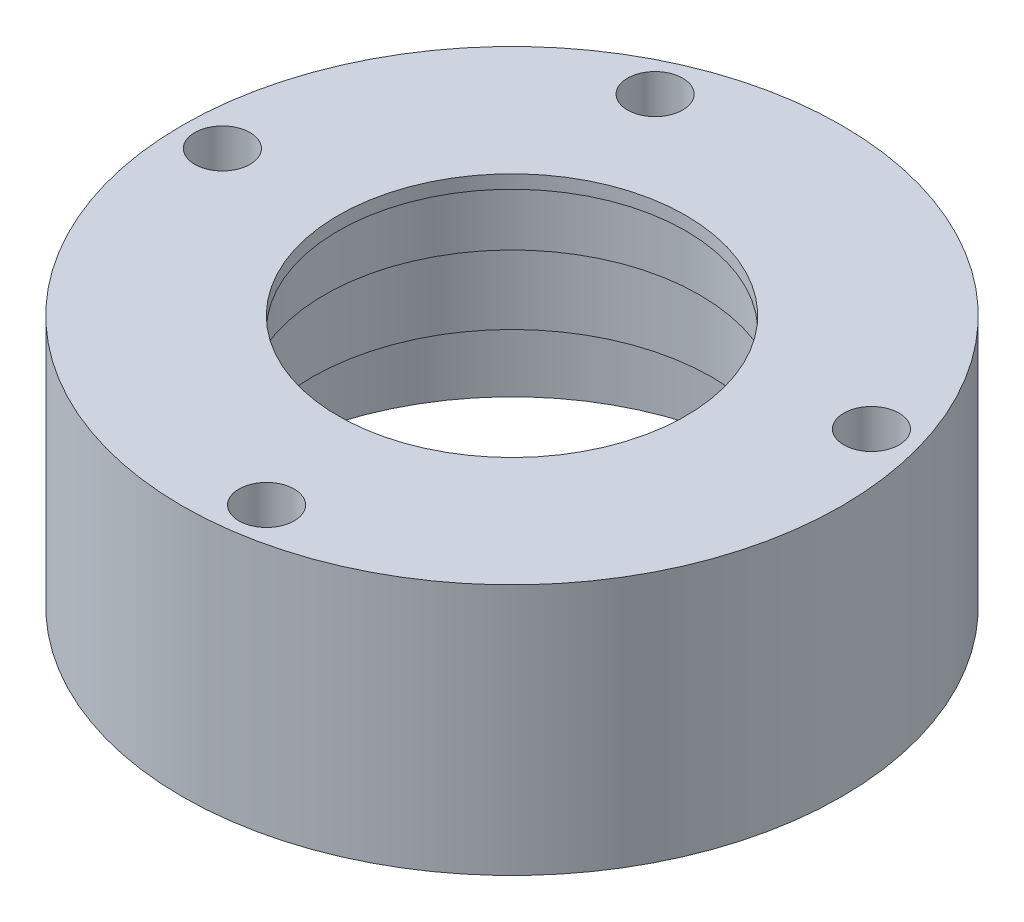
ISO-10303-21;
HEADER;
FILE_DESCRIPTION(('STEP AP214'),'2;1');
FILE_NAME('part.step','',(''),(''),'','','');
FILE_SCHEMA(('AUTOMOTIVE_DESIGN { 1 0 10303 214 1 1 1 1 }'));
ENDSEC;
DATA;
#1=APPLICATION_CONTEXT('core data for automotive mechanical design processes');
#2=APPLICATION_PROTOCOL_DEFINITION('international standard','automotive_design',2000,#1);
#3=PRODUCT_CONTEXT('',#1,'mechanical');
#4=PRODUCT('Part','Part','',(#3));
#5=PRODUCT_RELATED_PRODUCT_CATEGORY('part','',(#4));
#6=PRODUCT_DEFINITION_FORMATION('','',#4);
#7=PRODUCT_DEFINITION_CONTEXT('part definition',#1,'design');
#8=PRODUCT_DEFINITION('design','',#6,#7);
#9=PRODUCT_DEFINITION_SHAPE('','',#8);
#10=(LENGTH_UNIT() NAMED_UNIT(*) SI_UNIT(.MILLI.,.METRE.));
#11=(NAMED_UNIT(*) PLANE_ANGLE_UNIT() SI_UNIT($,.RADIAN.));
#12=(NAMED_UNIT(*) SI_UNIT($,.STERADIAN.) SOLID_ANGLE_UNIT());
#13=UNCERTAINTY_MEASURE_WITH_UNIT(LENGTH_MEASURE(1.E-05),#10,'distance_accuracy_value','');
#14=(GEOMETRIC_REPRESENTATION_CONTEXT(3) GLOBAL_UNCERTAINTY_ASSIGNED_CONTEXT((#13)) GLOBAL_UNIT_ASSIGNED_CONTEXT((#10,
#11,#12)) REPRESENTATION_CONTEXT('',''));
#15=CARTESIAN_POINT('',(0.,0.,0.));
#16=DIRECTION('',(0.,0.,1.));
#17=DIRECTION('',(1.,0.,0.));
#18=AXIS2_PLACEMENT_3D('',#15,#16,#17);
#19=CARTESIAN_POINT('',(4.62421140809311,28.25,32.1693436186264));
#20=DIRECTION('',(0.,-1.,0.));
#21=DIRECTION('',(0.,0.,-1.));
#22=AXIS2_PLACEMENT_3D('',#19,#20,#21);
#23=CYLINDRICAL_SURFACE('',#22,1.7);
#24=CARTESIAN_POINT('',(4.62421140809311,0.,32.1693436186264));
#25=DIRECTION('',(0.,1.,0.));
#26=DIRECTION('',(0.,0.,1.));
#27=AXIS2_PLACEMENT_3D('',#24,#25,#26);
#28=CIRCLE('',#27,1.7);
#29=CARTESIAN_POINT('',(4.62421140809311,0.,33.8693436186264));
#30=VERTEX_POINT('',#29);
#31=EDGE_CURVE('E103',#30,#30,#28,.T.);
#32=ORIENTED_EDGE('',*,*,#31,.F.);
#33=EDGE_LOOP('',(#32));
#34=FACE_BOUND('',#33,.T.);
#35=CARTESIAN_POINT('',(4.62421140809311,11.5,32.1693436186264));
#36=DIRECTION('',(0.,1.,0.));
#37=DIRECTION('',(0.,0.,1.));
#38=AXIS2_PLACEMENT_3D('',#35,#36,#37);
#39=CIRCLE('',#38,1.7);
#40=CARTESIAN_POINT('',(4.62421140809311,11.5,33.8693436186264));
#41=VERTEX_POINT('',#40);
#42=EDGE_CURVE('E41',#41,#41,#39,.T.);
#43=ORIENTED_EDGE('',*,*,#42,.T.);
#44=EDGE_LOOP('',(#43));
#45=FACE_BOUND('',#44,.T.);
#46=ADVANCED_FACE('F40',(#34,#45),#23,.F.);
#47=CARTESIAN_POINT('',(-32.5,28.25,-2.26946287024804E-13));
#48=DIRECTION('',(0.,-1.,0.));
#49=DIRECTION('',(0.,0.,-1.));
#50=AXIS2_PLACEMENT_3D('',#47,#48,#49);
#51=CYLINDRICAL_SURFACE('',#50,1.7);
#52=CARTESIAN_POINT('',(-32.5,0.,-2.26946287024804E-13));
#53=DIRECTION('',(0.,1.,0.));
#54=DIRECTION('',(0.,0.,1.));
#55=AXIS2_PLACEMENT_3D('',#52,#53,#54);
#56=CIRCLE('',#55,1.7);
#57=CARTESIAN_POINT('',(-32.5,0.,1.69999999999977));
#58=VERTEX_POINT('',#57);
#59=EDGE_CURVE('E110',#58,#58,#56,.T.);
#60=ORIENTED_EDGE('',*,*,#59,.F.);
#61=EDGE_LOOP('',(#60));
#62=FACE_BOUND('',#61,.T.);
#63=CARTESIAN_POINT('',(-32.5,11.5,-2.26946287024804E-13));
#64=DIRECTION('',(0.,1.,0.));
#65=DIRECTION('',(0.,0.,1.));
#66=AXIS2_PLACEMENT_3D('',#63,#64,#65);
#67=CIRCLE('',#66,1.7);
#68=CARTESIAN_POINT('',(-32.5,11.5,1.69999999999977));
#69=VERTEX_POINT('',#68);
#70=EDGE_CURVE('E98',#69,#69,#67,.T.);
#71=ORIENTED_EDGE('',*,*,#70,.T.);
#72=EDGE_LOOP('',(#71));
#73=FACE_BOUND('',#72,.T.);
#74=ADVANCED_FACE('F189',(#62,#73),#51,.F.);
#75=CARTESIAN_POINT('',(-13.5033332090834,28.25,-29.5619686801212));
#76=DIRECTION('',(0.,-1.,0.));
#77=DIRECTION('',(0.,0.,-1.));
#78=AXIS2_PLACEMENT_3D('',#75,#76,#77);
#79=CYLINDRICAL_SURFACE('',#78,1.7);
#80=CARTESIAN_POINT('',(-13.5033332090834,0.,-29.5619686801212));
#81=DIRECTION('',(0.,1.,0.));
#82=DIRECTION('',(0.,0.,1.));
#83=AXIS2_PLACEMENT_3D('',#80,#81,#82);
#84=CIRCLE('',#83,1.7);
#85=CARTESIAN_POINT('',(-13.5033332090834,0.,-27.8619686801212));
#86=VERTEX_POINT('',#85);
#87=EDGE_CURVE('E115',#86,#86,#84,.T.);
#88=ORIENTED_EDGE('',*,*,#87,.F.);
#89=EDGE_LOOP('',(#88));
#90=FACE_BOUND('',#89,.T.);
#91=CARTESIAN_POINT('',(-13.5033332090834,11.5,-29.5619686801212));
#92=DIRECTION('',(0.,1.,0.));
#93=DIRECTION('',(0.,0.,1.));
#94=AXIS2_PLACEMENT_3D('',#91,#92,#93);
#95=CIRCLE('',#94,1.7);
#96=CARTESIAN_POINT('',(-13.5033332090834,11.5,-27.8619686801212));
#97=VERTEX_POINT('',#96);
#98=EDGE_CURVE('E92',#97,#97,#95,.T.);
#99=ORIENTED_EDGE('',*,*,#98,.T.);
#100=EDGE_LOOP('',(#99));
#101=FACE_BOUND('',#100,.T.);
#102=ADVANCED_FACE('F198',(#90,#101),#79,.F.);
#103=CARTESIAN_POINT('',(31.1841026986622,28.25,-9.15432896936147));
#104=DIRECTION('',(0.,-1.,0.));
#105=DIRECTION('',(0.,0.,-1.));
#106=AXIS2_PLACEMENT_3D('',#103,#104,#105);
#107=CYLINDRICAL_SURFACE('',#106,1.7);
#108=CARTESIAN_POINT('',(31.1841026986622,0.,-9.15432896936147));
#109=DIRECTION('',(0.,1.,0.));
#110=DIRECTION('',(0.,0.,1.));
#111=AXIS2_PLACEMENT_3D('',#108,#109,#110);
#112=CIRCLE('',#111,1.7);
#113=CARTESIAN_POINT('',(31.1841026986622,0.,-7.45432896936148));
#114=VERTEX_POINT('',#113);
#115=EDGE_CURVE('E141',#114,#114,#112,.T.);
#116=ORIENTED_EDGE('',*,*,#115,.F.);
#117=EDGE_LOOP('',(#116));
#118=FACE_BOUND('',#117,.T.);
#119=CARTESIAN_POINT('',(31.1841026986622,11.5,-9.15432896936147));
#120=DIRECTION('',(0.,1.,0.));
#121=DIRECTION('',(0.,0.,1.));
#122=AXIS2_PLACEMENT_3D('',#119,#120,#121);
#123=CIRCLE('',#122,1.7);
#124=CARTESIAN_POINT('',(31.1841026986622,11.5,-7.45432896936148));
#125=VERTEX_POINT('',#124);
#126=EDGE_CURVE('E95',#125,#125,#123,.T.);
#127=ORIENTED_EDGE('',*,*,#126,.T.);
#128=EDGE_LOOP('',(#127));
#129=FACE_BOUND('',#128,.T.);
#130=ADVANCED_FACE('F496',(#118,#129),#107,.F.);
#131=CARTESIAN_POINT('',(0.,28.25,0.));
#132=DIRECTION('',(0.,-1.,0.));
#133=DIRECTION('',(0.,0.,-1.));
#134=AXIS2_PLACEMENT_3D('',#131,#132,#133);
#135=CYLINDRICAL_SURFACE('',#134,37.);
#136=CARTESIAN_POINT('',(0.,28.25,0.));
#137=DIRECTION('',(0.,1.,0.));
#138=DIRECTION('',(0.,0.,1.));
#139=AXIS2_PLACEMENT_3D('',#136,#137,#138);
#140=CIRCLE('',#139,37.);
#141=CARTESIAN_POINT('',(0.,28.25,37.));
#142=VERTEX_POINT('',#141);
#143=EDGE_CURVE('E10',#142,#142,#140,.T.);
#144=ORIENTED_EDGE('',*,*,#143,.F.);
#145=EDGE_LOOP('',(#144));
#146=FACE_BOUND('',#145,.T.);
#147=CARTESIAN_POINT('',(0.,0.,0.));
#148=DIRECTION('',(0.,1.,0.));
#149=DIRECTION('',(0.,0.,1.));
#150=AXIS2_PLACEMENT_3D('',#147,#148,#149);
#151=CIRCLE('',#150,37.);
#152=CARTESIAN_POINT('',(0.,0.,37.));
#153=VERTEX_POINT('',#152);
#154=EDGE_CURVE('E44',#153,#153,#151,.T.);
#155=ORIENTED_EDGE('',*,*,#154,.T.);
#156=EDGE_LOOP('',(#155));
#157=FACE_BOUND('',#156,.T.);
#158=ADVANCED_FACE('F39',(#146,#157),#135,.T.);
#159=CARTESIAN_POINT('',(0.,28.25,0.));
#160=DIRECTION('',(0.,1.,0.));
#161=DIRECTION('',(0.,0.,1.));
#162=AXIS2_PLACEMENT_3D('',#159,#160,#161);
#163=PLANE('',#162);
#164=CARTESIAN_POINT('',(31.1841026986622,28.25,-9.15432896936147));
#165=DIRECTION('',(0.,1.,0.));
#166=DIRECTION('',(0.,0.,1.));
#167=AXIS2_PLACEMENT_3D('',#164,#165,#166);
#168=CIRCLE('',#167,3.10000000000001);
#169=CARTESIAN_POINT('',(31.1841026986622,28.25,-6.05432896936147));
#170=VERTEX_POINT('',#169);
#171=EDGE_CURVE('E608',#170,#170,#168,.T.);
#172=ORIENTED_EDGE('',*,*,#171,.F.);
#173=EDGE_LOOP('',(#172));
#174=FACE_BOUND('',#173,.T.);
#175=CARTESIAN_POINT('',(-13.5033332090834,28.25,-29.5619686801212));
#176=DIRECTION('',(0.,1.,0.));
#177=DIRECTION('',(0.,0.,1.));
#178=AXIS2_PLACEMENT_3D('',#175,#176,#177);
#179=CIRCLE('',#178,3.1);
#180=CARTESIAN_POINT('',(-13.5033332090834,28.25,-26.4619686801212));
#181=VERTEX_POINT('',#180);
#182=EDGE_CURVE('E612',#181,#181,#179,.T.);
#183=ORIENTED_EDGE('',*,*,#182,.F.);
#184=EDGE_LOOP('',(#183));
#185=FACE_BOUND('',#184,.T.);
#186=CARTESIAN_POINT('',(-32.5,28.25,-2.26946287024804E-13));
#187=DIRECTION('',(0.,1.,0.));
#188=DIRECTION('',(0.,0.,1.));
#189=AXIS2_PLACEMENT_3D('',#186,#187,#188);
#190=CIRCLE('',#189,3.1);
#191=CARTESIAN_POINT('',(-32.5,28.25,3.09999999999977));
#192=VERTEX_POINT('',#191);
#193=EDGE_CURVE('E616',#192,#192,#190,.T.);
#194=ORIENTED_EDGE('',*,*,#193,.F.);
#195=EDGE_LOOP('',(#194));
#196=FACE_BOUND('',#195,.T.);
#197=CARTESIAN_POINT('',(4.62421140809311,28.25,32.1693436186264));
#198=DIRECTION('',(0.,1.,0.));
#199=DIRECTION('',(0.,0.,1.));
#200=AXIS2_PLACEMENT_3D('',#197,#198,#199);
#201=CIRCLE('',#200,3.1);
#202=CARTESIAN_POINT('',(4.62421140809311,28.25,35.2693436186264));
#203=VERTEX_POINT('',#202);
#204=EDGE_CURVE('E625',#203,#203,#201,.T.);
#205=ORIENTED_EDGE('',*,*,#204,.F.);
#206=EDGE_LOOP('',(#205));
#207=FACE_BOUND('',#206,.T.);
#208=CARTESIAN_POINT('',(0.,28.25,0.));
#209=DIRECTION('',(0.,-1.,0.));
#210=DIRECTION('',(0.,0.,-1.));
#211=AXIS2_PLACEMENT_3D('',#208,#209,#210);
#212=CIRCLE('',#211,19.5);
#213=CARTESIAN_POINT('',(0.,28.25,-19.5));
#214=VERTEX_POINT('',#213);
#215=EDGE_CURVE('E146',#214,#214,#212,.T.);
#216=ORIENTED_EDGE('',*,*,#215,.T.);
#217=EDGE_LOOP('',(#216));
#218=FACE_BOUND('',#217,.T.);
#219=ORIENTED_EDGE('',*,*,#143,.T.);
#220=EDGE_LOOP('',(#219));
#221=FACE_BOUND('',#220,.T.);
#222=ADVANCED_FACE('F188',(#174,#185,#196,#207,#218,#221),#163,.T.);
#223=CARTESIAN_POINT('',(0.,0.,0.));
#224=DIRECTION('',(0.,1.,0.));
#225=DIRECTION('',(0.,0.,1.));
#226=AXIS2_PLACEMENT_3D('',#223,#224,#225);
#227=PLANE('',#226);
#228=ORIENTED_EDGE('',*,*,#115,.T.);
#229=EDGE_LOOP('',(#228));
#230=FACE_BOUND('',#229,.T.);
#231=ORIENTED_EDGE('',*,*,#87,.T.);
#232=EDGE_LOOP('',(#231));
#233=FACE_BOUND('',#232,.T.);
#234=ORIENTED_EDGE('',*,*,#59,.T.);
#235=EDGE_LOOP('',(#234));
#236=FACE_BOUND('',#235,.T.);
#237=ORIENTED_EDGE('',*,*,#31,.T.);
#238=EDGE_LOOP('',(#237));
#239=FACE_BOUND('',#238,.T.);
#240=CARTESIAN_POINT('',(0.,0.,0.));
#241=DIRECTION('',(0.,1.,0.));
#242=DIRECTION('',(0.,0.,1.));
#243=AXIS2_PLACEMENT_3D('',#240,#241,#242);
#244=CIRCLE('',#243,28.8);
#245=CARTESIAN_POINT('',(0.,0.,28.8));
#246=VERTEX_POINT('',#245);
#247=EDGE_CURVE('E52',#246,#246,#244,.T.);
#248=ORIENTED_EDGE('',*,*,#247,.T.);
#249=EDGE_LOOP('',(#248));
#250=FACE_BOUND('',#249,.T.);
#251=ORIENTED_EDGE('',*,*,#154,.F.);
#252=EDGE_LOOP('',(#251));
#253=FACE_BOUND('',#252,.T.);
#254=ADVANCED_FACE('F168',(#230,#233,#236,#239,#250,#253),#227,.F.);
#255=CARTESIAN_POINT('',(0.,11.,0.));
#256=DIRECTION('',(0.,-1.,0.));
#257=DIRECTION('',(0.,0.,-1.));
#258=AXIS2_PLACEMENT_3D('',#255,#256,#257);
#259=CYLINDRICAL_SURFACE('',#258,28.8);
#260=CARTESIAN_POINT('',(0.,11.,0.));
#261=DIRECTION('',(0.,1.,0.));
#262=DIRECTION('',(0.,0.,1.));
#263=AXIS2_PLACEMENT_3D('',#260,#261,#262);
#264=CIRCLE('',#263,28.8);
#265=CARTESIAN_POINT('',(0.,11.,28.8));
#266=VERTEX_POINT('',#265);
#267=EDGE_CURVE('E49',#266,#266,#264,.T.);
#268=ORIENTED_EDGE('',*,*,#267,.T.);
#269=EDGE_LOOP('',(#268));
#270=FACE_BOUND('',#269,.T.);
#271=ORIENTED_EDGE('',*,*,#247,.F.);
#272=EDGE_LOOP('',(#271));
#273=FACE_BOUND('',#272,.T.);
#274=ADVANCED_FACE('F171',(#270,#273),#259,.F.);
#275=CARTESIAN_POINT('',(0.,11.,0.));
#276=DIRECTION('',(0.,1.,0.));
#277=DIRECTION('',(0.,0.,1.));
#278=AXIS2_PLACEMENT_3D('',#275,#276,#277);
#279=PLANE('',#278);
#280=CARTESIAN_POINT('',(22.7138453864421,11.,14.5973020713008));
#281=DIRECTION('',(0.,1.,0.));
#282=DIRECTION('',(0.,0.,1.));
#283=AXIS2_PLACEMENT_3D('',#280,#281,#282);
#284=CIRCLE('',#283,1.675);
#285=CARTESIAN_POINT('',(22.7138453864421,11.,16.2723020713008));
#286=VERTEX_POINT('',#285);
#287=EDGE_CURVE('E90',#286,#286,#284,.F.);
#288=ORIENTED_EDGE('',*,*,#287,.F.);
#289=EDGE_LOOP('',(#288));
#290=FACE_BOUND('',#289,.T.);
#291=CARTESIAN_POINT('',(11.2162053510512,11.,24.5600638745719));
#292=DIRECTION('',(0.,1.,0.));
#293=DIRECTION('',(0.,0.,1.));
#294=AXIS2_PLACEMENT_3D('',#291,#292,#293);
#295=CIRCLE('',#294,1.675);
#296=CARTESIAN_POINT('',(11.2162053510512,11.,26.2350638745719));
#297=VERTEX_POINT('',#296);
#298=EDGE_CURVE('E88',#297,#297,#295,.F.);
#299=ORIENTED_EDGE('',*,*,#298,.F.);
#300=EDGE_LOOP('',(#299));
#301=FACE_BOUND('',#300,.T.);
#302=CARTESIAN_POINT('',(-3.84250063337842,11.,26.7251789307852));
#303=DIRECTION('',(0.,1.,0.));
#304=DIRECTION('',(0.,0.,1.));
#305=AXIS2_PLACEMENT_3D('',#302,#303,#304);
#306=CIRCLE('',#305,1.675);
#307=CARTESIAN_POINT('',(-3.84250063337842,11.,28.4001789307852));
#308=VERTEX_POINT('',#307);
#309=EDGE_CURVE('E81',#308,#308,#306,.F.);
#310=ORIENTED_EDGE('',*,*,#309,.F.);
#311=EDGE_LOOP('',(#310));
#312=FACE_BOUND('',#311,.T.);
#313=CARTESIAN_POINT('',(-17.6812398165225,11.,20.4052385075651));
#314=DIRECTION('',(0.,1.,0.));
#315=DIRECTION('',(0.,0.,1.));
#316=AXIS2_PLACEMENT_3D('',#313,#314,#315);
#317=CIRCLE('',#316,1.675);
#318=CARTESIAN_POINT('',(-17.6812398165225,11.,22.0802385075651));
#319=VERTEX_POINT('',#318);
#320=EDGE_CURVE('E79',#319,#319,#317,.F.);
#321=ORIENTED_EDGE('',*,*,#320,.F.);
#322=EDGE_LOOP('',(#321));
#323=FACE_BOUND('',#322,.T.);
#324=CARTESIAN_POINT('',(-25.9063102875914,11.,7.6067790347188));
#325=DIRECTION('',(0.,1.,0.));
#326=DIRECTION('',(0.,0.,1.));
#327=AXIS2_PLACEMENT_3D('',#324,#325,#326);
#328=CIRCLE('',#327,1.675);
#329=CARTESIAN_POINT('',(-25.9063102875914,11.,9.2817790347188));
#330=VERTEX_POINT('',#329);
#331=EDGE_CURVE('E80',#330,#330,#328,.F.);
#332=ORIENTED_EDGE('',*,*,#331,.F.);
#333=EDGE_LOOP('',(#332));
#334=FACE_BOUND('',#333,.T.);
#335=CARTESIAN_POINT('',(-25.9063102875915,11.,-7.60677903471843));
#336=DIRECTION('',(0.,1.,0.));
#337=DIRECTION('',(0.,0.,1.));
#338=AXIS2_PLACEMENT_3D('',#335,#336,#337);
#339=CIRCLE('',#338,1.675);
#340=CARTESIAN_POINT('',(-25.9063102875915,11.,-5.93177903471843));
#341=VERTEX_POINT('',#340);
#342=EDGE_CURVE('E74',#341,#341,#339,.F.);
#343=ORIENTED_EDGE('',*,*,#342,.F.);
#344=EDGE_LOOP('',(#343));
#345=FACE_BOUND('',#344,.T.);
#346=CARTESIAN_POINT('',(-17.6812398165228,11.,-20.4052385075649));
#347=DIRECTION('',(0.,1.,0.));
#348=DIRECTION('',(0.,0.,1.));
#349=AXIS2_PLACEMENT_3D('',#346,#347,#348);
#350=CIRCLE('',#349,1.675);
#351=CARTESIAN_POINT('',(-17.6812398165228,11.,-18.7302385075649));
#352=VERTEX_POINT('',#351);
#353=EDGE_CURVE('E72',#352,#352,#350,.F.);
#354=ORIENTED_EDGE('',*,*,#353,.F.);
#355=EDGE_LOOP('',(#354));
#356=FACE_BOUND('',#355,.T.);
#357=CARTESIAN_POINT('',(-3.8425006333788,11.,-26.7251789307852));
#358=DIRECTION('',(0.,1.,0.));
#359=DIRECTION('',(0.,0.,1.));
#360=AXIS2_PLACEMENT_3D('',#357,#358,#359);
#361=CIRCLE('',#360,1.675);
#362=CARTESIAN_POINT('',(-3.8425006333788,11.,-25.0501789307852));
#363=VERTEX_POINT('',#362);
#364=EDGE_CURVE('E66',#363,#363,#361,.F.);
#365=ORIENTED_EDGE('',*,*,#364,.F.);
#366=EDGE_LOOP('',(#365));
#367=FACE_BOUND('',#366,.T.);
#368=CARTESIAN_POINT('',(11.2162053510509,11.,-24.560063874572));
#369=DIRECTION('',(0.,1.,0.));
#370=DIRECTION('',(0.,0.,1.));
#371=AXIS2_PLACEMENT_3D('',#368,#369,#370);
#372=CIRCLE('',#371,1.675);
#373=CARTESIAN_POINT('',(11.2162053510509,11.,-22.885063874572));
#374=VERTEX_POINT('',#373);
#375=EDGE_CURVE('E62',#374,#374,#372,.F.);
#376=ORIENTED_EDGE('',*,*,#375,.F.);
#377=EDGE_LOOP('',(#376));
#378=FACE_BOUND('',#377,.T.);
#379=CARTESIAN_POINT('',(22.7138453864419,11.,-14.5973020713012));
#380=DIRECTION('',(0.,1.,0.));
#381=DIRECTION('',(0.,0.,1.));
#382=AXIS2_PLACEMENT_3D('',#379,#380,#381);
#383=CIRCLE('',#382,1.675);
#384=CARTESIAN_POINT('',(22.7138453864419,11.,-12.9223020713012));
#385=VERTEX_POINT('',#384);
#386=EDGE_CURVE('E63',#385,#385,#383,.F.);
#387=ORIENTED_EDGE('',*,*,#386,.F.);
#388=EDGE_LOOP('',(#387));
#389=FACE_BOUND('',#388,.T.);
#390=CARTESIAN_POINT('',(27.,11.,0.));
#391=DIRECTION('',(0.,1.,0.));
#392=DIRECTION('',(0.,0.,1.));
#393=AXIS2_PLACEMENT_3D('',#390,#391,#392);
#394=CIRCLE('',#393,1.675);
#395=CARTESIAN_POINT('',(27.,11.,1.675));
#396=VERTEX_POINT('',#395);
#397=EDGE_CURVE('E57',#396,#396,#394,.F.);
#398=ORIENTED_EDGE('',*,*,#397,.F.);
#399=EDGE_LOOP('',(#398));
#400=FACE_BOUND('',#399,.T.);
#401=CARTESIAN_POINT('',(0.,11.,0.));
#402=DIRECTION('',(0.,-1.,0.));
#403=DIRECTION('',(0.,0.,-1.));
#404=AXIS2_PLACEMENT_3D('',#401,#402,#403);
#405=CIRCLE('',#404,22.5);
#406=CARTESIAN_POINT('',(0.,11.,-22.5));
#407=VERTEX_POINT('',#406);
#408=EDGE_CURVE('E160',#407,#407,#405,.T.);
#409=ORIENTED_EDGE('',*,*,#408,.F.);
#410=EDGE_LOOP('',(#409));
#411=FACE_BOUND('',#410,.T.);
#412=ORIENTED_EDGE('',*,*,#267,.F.);
#413=EDGE_LOOP('',(#412));
#414=FACE_BOUND('',#413,.T.);
#415=ADVANCED_FACE('F174',(#290,#301,#312,#323,#334,#345,#356,#367,#378,#389,#400,#411,#414),
#279,.F.);
#416=CARTESIAN_POINT('',(0.,19.75,0.));
#417=DIRECTION('',(0.,-1.,0.));
#418=DIRECTION('',(0.,0.,-1.));
#419=AXIS2_PLACEMENT_3D('',#416,#417,#418);
#420=CYLINDRICAL_SURFACE('',#419,22.5);
#421=CARTESIAN_POINT('',(0.,19.75,0.));
#422=DIRECTION('',(0.,-1.,0.));
#423=DIRECTION('',(0.,0.,-1.));
#424=AXIS2_PLACEMENT_3D('',#421,#422,#423);
#425=CIRCLE('',#424,22.5);
#426=CARTESIAN_POINT('',(0.,19.75,-22.5));
#427=VERTEX_POINT('',#426);
#428=EDGE_CURVE('E159',#427,#427,#425,.T.);
#429=ORIENTED_EDGE('',*,*,#428,.F.);
#430=EDGE_LOOP('',(#429));
#431=FACE_BOUND('',#430,.T.);
#432=ORIENTED_EDGE('',*,*,#408,.T.);
#433=EDGE_LOOP('',(#432));
#434=FACE_BOUND('',#433,.T.);
#435=ADVANCED_FACE('F185',(#431,#434),#420,.F.);
#436=CARTESIAN_POINT('',(0.,19.75,0.));
#437=DIRECTION('',(0.,-1.,0.));
#438=DIRECTION('',(0.,0.,-1.));
#439=AXIS2_PLACEMENT_3D('',#436,#437,#438);
#440=PLANE('',#439);
#441=CARTESIAN_POINT('',(0.,19.75,0.));
#442=DIRECTION('',(0.,-1.,0.));
#443=DIRECTION('',(0.,0.,-1.));
#444=AXIS2_PLACEMENT_3D('',#441,#442,#443);
#445=CIRCLE('',#444,21.05);
#446=CARTESIAN_POINT('',(0.,19.75,-21.05));
#447=VERTEX_POINT('',#446);
#448=EDGE_CURVE('E151',#447,#447,#445,.T.);
#449=ORIENTED_EDGE('',*,*,#448,.F.);
#450=EDGE_LOOP('',(#449));
#451=FACE_BOUND('',#450,.T.);
#452=ORIENTED_EDGE('',*,*,#428,.T.);
#453=EDGE_LOOP('',(#452));
#454=FACE_BOUND('',#453,.T.);
#455=ADVANCED_FACE('F303',(#451,#454),#440,.T.);
#456=CARTESIAN_POINT('',(0.,26.75,0.));
#457=DIRECTION('',(0.,-1.,0.));
#458=DIRECTION('',(0.,0.,-1.));
#459=AXIS2_PLACEMENT_3D('',#456,#457,#458);
#460=CYLINDRICAL_SURFACE('',#459,21.05);
#461=CARTESIAN_POINT('',(0.,26.75,0.));
#462=DIRECTION('',(0.,-1.,0.));
#463=DIRECTION('',(0.,0.,-1.));
#464=AXIS2_PLACEMENT_3D('',#461,#462,#463);
#465=CIRCLE('',#464,21.05);
#466=CARTESIAN_POINT('',(0.,26.75,-21.05));
#467=VERTEX_POINT('',#466);
#468=EDGE_CURVE('E152',#467,#467,#465,.T.);
#469=ORIENTED_EDGE('',*,*,#468,.F.);
#470=EDGE_LOOP('',(#469));
#471=FACE_BOUND('',#470,.T.);
#472=ORIENTED_EDGE('',*,*,#448,.T.);
#473=EDGE_LOOP('',(#472));
#474=FACE_BOUND('',#473,.T.);
#475=ADVANCED_FACE('F300',(#471,#474),#460,.F.);
#476=CARTESIAN_POINT('',(0.,26.75,0.));
#477=DIRECTION('',(0.,-1.,0.));
#478=DIRECTION('',(0.,0.,-1.));
#479=AXIS2_PLACEMENT_3D('',#476,#477,#478);
#480=PLANE('',#479);
#481=CARTESIAN_POINT('',(0.,26.75,0.));
#482=DIRECTION('',(0.,-1.,0.));
#483=DIRECTION('',(0.,0.,-1.));
#484=AXIS2_PLACEMENT_3D('',#481,#482,#483);
#485=CIRCLE('',#484,19.5);
#486=CARTESIAN_POINT('',(0.,26.75,-19.5));
#487=VERTEX_POINT('',#486);
#488=EDGE_CURVE('E56',#487,#487,#485,.T.);
#489=ORIENTED_EDGE('',*,*,#488,.F.);
#490=EDGE_LOOP('',(#489));
#491=FACE_BOUND('',#490,.T.);
#492=ORIENTED_EDGE('',*,*,#468,.T.);
#493=EDGE_LOOP('',(#492));
#494=FACE_BOUND('',#493,.T.);
#495=ADVANCED_FACE('F291',(#491,#494),#480,.T.);
#496=CARTESIAN_POINT('',(0.,28.25,0.));
#497=DIRECTION('',(0.,-1.,0.));
#498=DIRECTION('',(0.,0.,-1.));
#499=AXIS2_PLACEMENT_3D('',#496,#497,#498);
#500=CYLINDRICAL_SURFACE('',#499,19.5);
#501=ORIENTED_EDGE('',*,*,#215,.F.);
#502=EDGE_LOOP('',(#501));
#503=FACE_BOUND('',#502,.T.);
#504=ORIENTED_EDGE('',*,*,#488,.T.);
#505=EDGE_LOOP('',(#504));
#506=FACE_BOUND('',#505,.T.);
#507=ADVANCED_FACE('F287',(#503,#506),#500,.F.);
#508=CARTESIAN_POINT('',(27.,15.75,0.));
#509=DIRECTION('',(0.,-1.,0.));
#510=DIRECTION('',(0.,0.,-1.));
#511=AXIS2_PLACEMENT_3D('',#508,#509,#510);
#512=CYLINDRICAL_SURFACE('',#511,1.675);
#513=CARTESIAN_POINT('',(27.,15.75,0.));
#514=DIRECTION('',(0.,1.,0.));
#515=DIRECTION('',(0.,0.,1.));
#516=AXIS2_PLACEMENT_3D('',#513,#514,#515);
#517=CIRCLE('',#516,1.675);
#518=CARTESIAN_POINT('',(27.,15.75,1.675));
#519=VERTEX_POINT('',#518);
#520=EDGE_CURVE('E58',#519,#519,#517,.T.);
#521=ORIENTED_EDGE('',*,*,#520,.T.);
#522=EDGE_LOOP('',(#521));
#523=FACE_BOUND('',#522,.T.);
#524=ORIENTED_EDGE('',*,*,#397,.T.);
#525=EDGE_LOOP('',(#524));
#526=FACE_BOUND('',#525,.T.);
#527=ADVANCED_FACE('F284',(#523,#526),#512,.F.);
#528=CARTESIAN_POINT('',(27.,15.75,0.));
#529=DIRECTION('',(0.,1.,0.));
#530=DIRECTION('',(0.,0.,1.));
#531=AXIS2_PLACEMENT_3D('',#528,#529,#530);
#532=PLANE('',#531);
#533=ORIENTED_EDGE('',*,*,#520,.F.);
#534=EDGE_LOOP('',(#533));
#535=FACE_BOUND('',#534,.T.);
#536=ADVANCED_FACE('F283',(#535),#532,.F.);
#537=CARTESIAN_POINT('',(22.7138453864419,15.75,-14.5973020713012));
#538=DIRECTION('',(0.,-1.,0.));
#539=DIRECTION('',(0.,0.,-1.));
#540=AXIS2_PLACEMENT_3D('',#537,#538,#539);
#541=CYLINDRICAL_SURFACE('',#540,1.675);
#542=CARTESIAN_POINT('',(22.7138453864419,15.75,-14.5973020713012));
#543=DIRECTION('',(0.,1.,0.));
#544=DIRECTION('',(0.540640817455599,0.,0.841253532831181));
#545=AXIS2_PLACEMENT_3D('',#542,#543,#544);
#546=CIRCLE('',#545,1.675);
#547=CARTESIAN_POINT('',(23.61941875568,15.75,-13.1882024038089));
#548=VERTEX_POINT('',#547);
#549=EDGE_CURVE('E64',#548,#548,#546,.T.);
#550=ORIENTED_EDGE('',*,*,#549,.T.);
#551=EDGE_LOOP('',(#550));
#552=FACE_BOUND('',#551,.T.);
#553=ORIENTED_EDGE('',*,*,#386,.T.);
#554=EDGE_LOOP('',(#553));
#555=FACE_BOUND('',#554,.T.);
#556=ADVANCED_FACE('F280',(#552,#555),#541,.F.);
#557=CARTESIAN_POINT('',(22.7138453864419,15.75,-14.5973020713012));
#558=DIRECTION('',(0.,1.,0.));
#559=DIRECTION('',(0.540640817455599,0.,0.841253532831181));
#560=AXIS2_PLACEMENT_3D('',#557,#558,#559);
#561=PLANE('',#560);
#562=ORIENTED_EDGE('',*,*,#549,.F.);
#563=EDGE_LOOP('',(#562));
#564=FACE_BOUND('',#563,.T.);
#565=ADVANCED_FACE('F207',(#564),#561,.F.);
#566=CARTESIAN_POINT('',(11.2162053510509,15.75,-24.560063874572));
#567=DIRECTION('',(0.,-1.,0.));
#568=DIRECTION('',(0.,0.,-1.));
#569=AXIS2_PLACEMENT_3D('',#566,#567,#568);
#570=CYLINDRICAL_SURFACE('',#569,1.675);
#571=CARTESIAN_POINT('',(11.2162053510509,15.75,-24.560063874572));
#572=DIRECTION('',(0.,1.,0.));
#573=DIRECTION('',(0.909631995354519,0.,0.415415013001884));
#574=AXIS2_PLACEMENT_3D('',#571,#572,#573);
#575=CIRCLE('',#574,1.675);
#576=CARTESIAN_POINT('',(12.7398389432697,15.75,-23.8642437277939));
#577=VERTEX_POINT('',#576);
#578=EDGE_CURVE('E118',#577,#577,#575,.T.);
#579=ORIENTED_EDGE('',*,*,#578,.T.);
#580=EDGE_LOOP('',(#579));
#581=FACE_BOUND('',#580,.T.);
#582=ORIENTED_EDGE('',*,*,#375,.T.);
#583=EDGE_LOOP('',(#582));
#584=FACE_BOUND('',#583,.T.);
#585=ADVANCED_FACE('F202',(#581,#584),#570,.F.);
#586=CARTESIAN_POINT('',(11.2162053510509,15.75,-24.560063874572));
#587=DIRECTION('',(0.,1.,0.));
#588=DIRECTION('',(0.909631995354519,0.,0.415415013001884));
#589=AXIS2_PLACEMENT_3D('',#586,#587,#588);
#590=PLANE('',#589);
#591=ORIENTED_EDGE('',*,*,#578,.F.);
#592=EDGE_LOOP('',(#591));
#593=FACE_BOUND('',#592,.T.);
#594=ADVANCED_FACE('F203',(#593),#590,.F.);
#595=CARTESIAN_POINT('',(-3.8425006333788,15.75,-26.7251789307852));
#596=DIRECTION('',(0.,-1.,0.));
#597=DIRECTION('',(0.,0.,-1.));
#598=AXIS2_PLACEMENT_3D('',#595,#596,#597);
#599=CYLINDRICAL_SURFACE('',#598,1.675);
#600=CARTESIAN_POINT('',(-3.8425006333788,15.75,-26.7251789307852));
#601=DIRECTION('',(0.,1.,0.));
#602=DIRECTION('',(0.989821441880932,0.,-0.142314838273289));
#603=AXIS2_PLACEMENT_3D('',#600,#601,#602);
#604=CIRCLE('',#603,1.675);
#605=CARTESIAN_POINT('',(-2.18454971822824,15.75,-26.9635562848929));
#606=VERTEX_POINT('',#605);
#607=EDGE_CURVE('E117',#606,#606,#604,.T.);
#608=ORIENTED_EDGE('',*,*,#607,.T.);
#609=EDGE_LOOP('',(#608));
#610=FACE_BOUND('',#609,.T.);
#611=ORIENTED_EDGE('',*,*,#364,.T.);
#612=EDGE_LOOP('',(#611));
#613=FACE_BOUND('',#612,.T.);
#614=ADVANCED_FACE('F204',(#610,#613),#599,.F.);
#615=CARTESIAN_POINT('',(-3.8425006333788,15.75,-26.7251789307852));
#616=DIRECTION('',(0.,1.,0.));
#617=DIRECTION('',(0.989821441880932,0.,-0.142314838273289));
#618=AXIS2_PLACEMENT_3D('',#615,#616,#617);
#619=PLANE('',#618);
#620=ORIENTED_EDGE('',*,*,#607,.F.);
#621=EDGE_LOOP('',(#620));
#622=FACE_BOUND('',#621,.T.);
#623=ADVANCED_FACE('F211',(#622),#619,.F.);
#624=CARTESIAN_POINT('',(-17.6812398165228,15.75,-20.4052385075649));
#625=DIRECTION('',(0.,-1.,0.));
#626=DIRECTION('',(0.,0.,-1.));
#627=AXIS2_PLACEMENT_3D('',#624,#625,#626);
#628=CYLINDRICAL_SURFACE('',#627,1.675);
#629=CARTESIAN_POINT('',(-17.6812398165228,15.75,-20.4052385075649));
#630=DIRECTION('',(0.,1.,0.));
#631=DIRECTION('',(0.755749574354255,0.,-0.654860733945289));
#632=AXIS2_PLACEMENT_3D('',#629,#630,#631);
#633=CIRCLE('',#632,1.675);
#634=CARTESIAN_POINT('',(-16.4153592794794,15.75,-21.5021302369232));
#635=VERTEX_POINT('',#634);
#636=EDGE_CURVE('E125',#635,#635,#633,.T.);
#637=ORIENTED_EDGE('',*,*,#636,.T.);
#638=EDGE_LOOP('',(#637));
#639=FACE_BOUND('',#638,.T.);
#640=ORIENTED_EDGE('',*,*,#353,.T.);
#641=EDGE_LOOP('',(#640));
#642=FACE_BOUND('',#641,.T.);
#643=ADVANCED_FACE('F212',(#639,#642),#628,.F.);
#644=CARTESIAN_POINT('',(-17.6812398165228,15.75,-20.4052385075649));
#645=DIRECTION('',(0.,1.,0.));
#646=DIRECTION('',(0.755749574354255,0.,-0.654860733945289));
#647=AXIS2_PLACEMENT_3D('',#644,#645,#646);
#648=PLANE('',#647);
#649=ORIENTED_EDGE('',*,*,#636,.F.);
#650=EDGE_LOOP('',(#649));
#651=FACE_BOUND('',#650,.T.);
#652=ADVANCED_FACE('F218',(#651),#648,.F.);
#653=CARTESIAN_POINT('',(-25.9063102875915,15.75,-7.60677903471843));
#654=DIRECTION('',(0.,-1.,0.));
#655=DIRECTION('',(0.,0.,-1.));
#656=AXIS2_PLACEMENT_3D('',#653,#654,#655);
#657=CYLINDRICAL_SURFACE('',#656,1.675);
#658=CARTESIAN_POINT('',(-25.9063102875915,15.75,-7.60677903471843));
#659=DIRECTION('',(0.,1.,0.));
#660=DIRECTION('',(0.281732556841423,0.,-0.959492973614499));
#661=AXIS2_PLACEMENT_3D('',#658,#659,#660);
#662=CIRCLE('',#661,1.675);
#663=CARTESIAN_POINT('',(-25.4344082548821,15.75,-9.21392976552272));
#664=VERTEX_POINT('',#663);
#665=EDGE_CURVE('E124',#664,#664,#662,.T.);
#666=ORIENTED_EDGE('',*,*,#665,.T.);
#667=EDGE_LOOP('',(#666));
#668=FACE_BOUND('',#667,.T.);
#669=ORIENTED_EDGE('',*,*,#342,.T.);
#670=EDGE_LOOP('',(#669));
#671=FACE_BOUND('',#670,.T.);
#672=ADVANCED_FACE('F225',(#668,#671),#657,.F.);
#673=CARTESIAN_POINT('',(-25.9063102875915,15.75,-7.60677903471843));
#674=DIRECTION('',(0.,1.,0.));
#675=DIRECTION('',(0.281732556841423,0.,-0.959492973614499));
#676=AXIS2_PLACEMENT_3D('',#673,#674,#675);
#677=PLANE('',#676);
#678=ORIENTED_EDGE('',*,*,#665,.F.);
#679=EDGE_LOOP('',(#678));
#680=FACE_BOUND('',#679,.T.);
#681=ADVANCED_FACE('F230',(#680),#677,.F.);
#682=CARTESIAN_POINT('',(-25.9063102875914,15.75,7.6067790347188));
#683=DIRECTION('',(0.,-1.,0.));
#684=DIRECTION('',(0.,0.,-1.));
#685=AXIS2_PLACEMENT_3D('',#682,#683,#684);
#686=CYLINDRICAL_SURFACE('',#685,1.675);
#687=CARTESIAN_POINT('',(-25.9063102875914,15.75,7.6067790347188));
#688=DIRECTION('',(0.,1.,0.));
#689=DIRECTION('',(-0.281732556841437,0.,-0.959492973614495));
#690=AXIS2_PLACEMENT_3D('',#687,#688,#689);
#691=CIRCLE('',#690,1.675);
#692=CARTESIAN_POINT('',(-26.3782123203008,15.75,5.99962830391452));
#693=VERTEX_POINT('',#692);
#694=EDGE_CURVE('E126',#693,#693,#691,.T.);
#695=ORIENTED_EDGE('',*,*,#694,.T.);
#696=EDGE_LOOP('',(#695));
#697=FACE_BOUND('',#696,.T.);
#698=ORIENTED_EDGE('',*,*,#331,.T.);
#699=EDGE_LOOP('',(#698));
#700=FACE_BOUND('',#699,.T.);
#701=ADVANCED_FACE('F229',(#697,#700),#686,.F.);
#702=CARTESIAN_POINT('',(-25.9063102875914,15.75,7.6067790347188));
#703=DIRECTION('',(0.,1.,0.));
#704=DIRECTION('',(-0.281732556841437,0.,-0.959492973614495));
#705=AXIS2_PLACEMENT_3D('',#702,#703,#704);
#706=PLANE('',#705);
#707=ORIENTED_EDGE('',*,*,#694,.F.);
#708=EDGE_LOOP('',(#707));
#709=FACE_BOUND('',#708,.T.);
#710=ADVANCED_FACE('F234',(#709),#706,.F.);
#711=CARTESIAN_POINT('',(-17.6812398165225,15.75,20.4052385075651));
#712=DIRECTION('',(0.,-1.,0.));
#713=DIRECTION('',(0.,0.,-1.));
#714=AXIS2_PLACEMENT_3D('',#711,#712,#713);
#715=CYLINDRICAL_SURFACE('',#714,1.675);
#716=CARTESIAN_POINT('',(-17.6812398165225,15.75,20.4052385075651));
#717=DIRECTION('',(0.,1.,0.));
#718=DIRECTION('',(-0.755749574354264,0.,-0.654860733945278));
#719=AXIS2_PLACEMENT_3D('',#716,#717,#718);
#720=CIRCLE('',#719,1.675);
#721=CARTESIAN_POINT('',(-18.9471203535659,15.75,19.3083467782068));
#722=VERTEX_POINT('',#721);
#723=EDGE_CURVE('E133',#722,#722,#720,.T.);
#724=ORIENTED_EDGE('',*,*,#723,.T.);
#725=EDGE_LOOP('',(#724));
#726=FACE_BOUND('',#725,.T.);
#727=ORIENTED_EDGE('',*,*,#320,.T.);
#728=EDGE_LOOP('',(#727));
#729=FACE_BOUND('',#728,.T.);
#730=ADVANCED_FACE('F236',(#726,#729),#715,.F.);
#731=CARTESIAN_POINT('',(-17.6812398165225,15.75,20.4052385075651));
#732=DIRECTION('',(0.,1.,0.));
#733=DIRECTION('',(-0.755749574354264,0.,-0.654860733945278));
#734=AXIS2_PLACEMENT_3D('',#731,#732,#733);
#735=PLANE('',#734);
#736=ORIENTED_EDGE('',*,*,#723,.F.);
#737=EDGE_LOOP('',(#736));
#738=FACE_BOUND('',#737,.T.);
#739=ADVANCED_FACE('F241',(#738),#735,.F.);
#740=CARTESIAN_POINT('',(-3.84250063337842,15.75,26.7251789307852));
#741=DIRECTION('',(0.,-1.,0.));
#742=DIRECTION('',(0.,0.,-1.));
#743=AXIS2_PLACEMENT_3D('',#740,#741,#742);
#744=CYLINDRICAL_SURFACE('',#743,1.675);
#745=CARTESIAN_POINT('',(-3.84250063337842,15.75,26.7251789307852));
#746=DIRECTION('',(0.,1.,0.));
#747=DIRECTION('',(-0.989821441880934,0.,-0.142314838273275));
#748=AXIS2_PLACEMENT_3D('',#745,#746,#747);
#749=CIRCLE('',#748,1.675);
#750=CARTESIAN_POINT('',(-5.50045154852898,15.75,26.4868015766775));
#751=VERTEX_POINT('',#750);
#752=EDGE_CURVE('E132',#751,#751,#749,.T.);
#753=ORIENTED_EDGE('',*,*,#752,.T.);
#754=EDGE_LOOP('',(#753));
#755=FACE_BOUND('',#754,.T.);
#756=ORIENTED_EDGE('',*,*,#309,.T.);
#757=EDGE_LOOP('',(#756));
#758=FACE_BOUND('',#757,.T.);
#759=ADVANCED_FACE('F248',(#755,#758),#744,.F.);
#760=CARTESIAN_POINT('',(-3.84250063337842,15.75,26.7251789307852));
#761=DIRECTION('',(0.,1.,0.));
#762=DIRECTION('',(-0.989821441880934,0.,-0.142314838273275));
#763=AXIS2_PLACEMENT_3D('',#760,#761,#762);
#764=PLANE('',#763);
#765=ORIENTED_EDGE('',*,*,#752,.F.);
#766=EDGE_LOOP('',(#765));
#767=FACE_BOUND('',#766,.T.);
#768=ADVANCED_FACE('F253',(#767),#764,.F.);
#769=CARTESIAN_POINT('',(11.2162053510512,15.75,24.5600638745719));
#770=DIRECTION('',(0.,-1.,0.));
#771=DIRECTION('',(0.,0.,-1.));
#772=AXIS2_PLACEMENT_3D('',#769,#770,#771);
#773=CYLINDRICAL_SURFACE('',#772,1.675);
#774=CARTESIAN_POINT('',(11.2162053510512,15.75,24.5600638745719));
#775=DIRECTION('',(0.,1.,0.));
#776=DIRECTION('',(-0.909631995354513,0.,0.415415013001897));
#777=AXIS2_PLACEMENT_3D('',#774,#775,#776);
#778=CIRCLE('',#777,1.675);
#779=CARTESIAN_POINT('',(9.69257175883242,15.75,25.25588402135));
#780=VERTEX_POINT('',#779);
#781=EDGE_CURVE('E140',#780,#780,#778,.T.);
#782=ORIENTED_EDGE('',*,*,#781,.T.);
#783=EDGE_LOOP('',(#782));
#784=FACE_BOUND('',#783,.T.);
#785=ORIENTED_EDGE('',*,*,#298,.T.);
#786=EDGE_LOOP('',(#785));
#787=FACE_BOUND('',#786,.T.);
#788=ADVANCED_FACE('F255',(#784,#787),#773,.F.);
#789=CARTESIAN_POINT('',(11.2162053510512,15.75,24.5600638745719));
#790=DIRECTION('',(0.,1.,0.));
#791=DIRECTION('',(-0.909631995354513,0.,0.415415013001897));
#792=AXIS2_PLACEMENT_3D('',#789,#790,#791);
#793=PLANE('',#792);
#794=ORIENTED_EDGE('',*,*,#781,.F.);
#795=EDGE_LOOP('',(#794));
#796=FACE_BOUND('',#795,.T.);
#797=ADVANCED_FACE('F259',(#796),#793,.F.);
#798=CARTESIAN_POINT('',(22.7138453864421,15.75,14.5973020713008));
#799=DIRECTION('',(0.,-1.,0.));
#800=DIRECTION('',(0.,0.,-1.));
#801=AXIS2_PLACEMENT_3D('',#798,#799,#800);
#802=CYLINDRICAL_SURFACE('',#801,1.675);
#803=CARTESIAN_POINT('',(22.7138453864421,15.75,14.5973020713008));
#804=DIRECTION('',(0.,1.,0.));
#805=DIRECTION('',(-0.540640817455586,0.,0.841253532831189));
#806=AXIS2_PLACEMENT_3D('',#803,#804,#805);
#807=CIRCLE('',#806,1.675);
#808=CARTESIAN_POINT('',(21.808272017204,15.75,16.0064017387931));
#809=VERTEX_POINT('',#808);
#810=EDGE_CURVE('E139',#809,#809,#807,.T.);
#811=ORIENTED_EDGE('',*,*,#810,.T.);
#812=EDGE_LOOP('',(#811));
#813=FACE_BOUND('',#812,.T.);
#814=ORIENTED_EDGE('',*,*,#287,.T.);
#815=EDGE_LOOP('',(#814));
#816=FACE_BOUND('',#815,.T.);
#817=ADVANCED_FACE('F265',(#813,#816),#802,.F.);
#818=CARTESIAN_POINT('',(22.7138453864421,15.75,14.5973020713008));
#819=DIRECTION('',(0.,1.,0.));
#820=DIRECTION('',(-0.540640817455586,0.,0.841253532831189));
#821=AXIS2_PLACEMENT_3D('',#818,#819,#820);
#822=PLANE('',#821);
#823=ORIENTED_EDGE('',*,*,#810,.F.);
#824=EDGE_LOOP('',(#823));
#825=FACE_BOUND('',#824,.T.);
#826=ADVANCED_FACE('F270',(#825),#822,.F.);
#827=CARTESIAN_POINT('',(31.1841026986622,11.5,-9.15432896936147));
#828=DIRECTION('',(0.,1.,0.));
#829=DIRECTION('',(0.,0.,1.));
#830=AXIS2_PLACEMENT_3D('',#827,#828,#829);
#831=CYLINDRICAL_SURFACE('',#830,3.10000000000001);
#832=CARTESIAN_POINT('',(31.1841026986622,11.5,-9.15432896936147));
#833=DIRECTION('',(0.,1.,0.));
#834=DIRECTION('',(0.,0.,1.));
#835=AXIS2_PLACEMENT_3D('',#832,#833,#834);
#836=CIRCLE('',#835,3.10000000000001);
#837=CARTESIAN_POINT('',(31.1841026986622,11.5,-6.05432896936147));
#838=VERTEX_POINT('',#837);
#839=EDGE_CURVE('E96',#838,#838,#836,.T.);
#840=ORIENTED_EDGE('',*,*,#839,.F.);
#841=EDGE_LOOP('',(#840));
#842=FACE_BOUND('',#841,.T.);
#843=ORIENTED_EDGE('',*,*,#171,.T.);
#844=EDGE_LOOP('',(#843));
#845=FACE_BOUND('',#844,.T.);
#846=ADVANCED_FACE('F269',(#842,#845),#831,.F.);
#847=CARTESIAN_POINT('',(31.1841026986622,11.5,-9.15432896936147));
#848=DIRECTION('',(0.,1.,0.));
#849=DIRECTION('',(0.,0.,1.));
#850=AXIS2_PLACEMENT_3D('',#847,#848,#849);
#851=PLANE('',#850);
#852=ORIENTED_EDGE('',*,*,#126,.F.);
#853=EDGE_LOOP('',(#852));
#854=FACE_BOUND('',#853,.T.);
#855=ORIENTED_EDGE('',*,*,#839,.T.);
#856=EDGE_LOOP('',(#855));
#857=FACE_BOUND('',#856,.T.);
#858=ADVANCED_FACE('F529',(#854,#857),#851,.T.);
#859=CARTESIAN_POINT('',(-13.5033332090834,11.5,-29.5619686801212));
#860=DIRECTION('',(0.,1.,0.));
#861=DIRECTION('',(0.,0.,1.));
#862=AXIS2_PLACEMENT_3D('',#859,#860,#861);
#863=CYLINDRICAL_SURFACE('',#862,3.1);
#864=CARTESIAN_POINT('',(-13.5033332090834,11.5,-29.5619686801212));
#865=DIRECTION('',(0.,1.,0.));
#866=DIRECTION('',(0.,0.,1.));
#867=AXIS2_PLACEMENT_3D('',#864,#865,#866);
#868=CIRCLE('',#867,3.1);
#869=CARTESIAN_POINT('',(-13.5033332090834,11.5,-26.4619686801212));
#870=VERTEX_POINT('',#869);
#871=EDGE_CURVE('E649',#870,#870,#868,.T.);
#872=ORIENTED_EDGE('',*,*,#871,.F.);
#873=EDGE_LOOP('',(#872));
#874=FACE_BOUND('',#873,.T.);
#875=ORIENTED_EDGE('',*,*,#182,.T.);
#876=EDGE_LOOP('',(#875));
#877=FACE_BOUND('',#876,.T.);
#878=ADVANCED_FACE('F537',(#874,#877),#863,.F.);
#879=CARTESIAN_POINT('',(-13.5033332090834,11.5,-29.5619686801212));
#880=DIRECTION('',(0.,1.,0.));
#881=DIRECTION('',(0.,0.,1.));
#882=AXIS2_PLACEMENT_3D('',#879,#880,#881);
#883=PLANE('',#882);
#884=ORIENTED_EDGE('',*,*,#98,.F.);
#885=EDGE_LOOP('',(#884));
#886=FACE_BOUND('',#885,.T.);
#887=ORIENTED_EDGE('',*,*,#871,.T.);
#888=EDGE_LOOP('',(#887));
#889=FACE_BOUND('',#888,.T.);
#890=ADVANCED_FACE('F547',(#886,#889),#883,.T.);
#891=CARTESIAN_POINT('',(-32.5,11.5,-2.26946287024804E-13));
#892=DIRECTION('',(0.,1.,0.));
#893=DIRECTION('',(0.,0.,1.));
#894=AXIS2_PLACEMENT_3D('',#891,#892,#893);
#895=CYLINDRICAL_SURFACE('',#894,3.1);
#896=CARTESIAN_POINT('',(-32.5,11.5,-2.26946287024804E-13));
#897=DIRECTION('',(0.,1.,0.));
#898=DIRECTION('',(0.,0.,1.));
#899=AXIS2_PLACEMENT_3D('',#896,#897,#898);
#900=CIRCLE('',#899,3.1);
#901=CARTESIAN_POINT('',(-32.5,11.5,3.09999999999977));
#902=VERTEX_POINT('',#901);
#903=EDGE_CURVE('E633',#902,#902,#900,.T.);
#904=ORIENTED_EDGE('',*,*,#903,.F.);
#905=EDGE_LOOP('',(#904));
#906=FACE_BOUND('',#905,.T.);
#907=ORIENTED_EDGE('',*,*,#193,.T.);
#908=EDGE_LOOP('',(#907));
#909=FACE_BOUND('',#908,.T.);
#910=ADVANCED_FACE('F560',(#906,#909),#895,.F.);
#911=CARTESIAN_POINT('',(-32.5,11.5,-2.26946287024804E-13));
#912=DIRECTION('',(0.,1.,0.));
#913=DIRECTION('',(0.,0.,1.));
#914=AXIS2_PLACEMENT_3D('',#911,#912,#913);
#915=PLANE('',#914);
#916=ORIENTED_EDGE('',*,*,#70,.F.);
#917=EDGE_LOOP('',(#916));
#918=FACE_BOUND('',#917,.T.);
#919=ORIENTED_EDGE('',*,*,#903,.T.);
#920=EDGE_LOOP('',(#919));
#921=FACE_BOUND('',#920,.T.);
#922=ADVANCED_FACE('F567',(#918,#921),#915,.T.);
#923=CARTESIAN_POINT('',(4.62421140809311,11.5,32.1693436186264));
#924=DIRECTION('',(0.,1.,0.));
#925=DIRECTION('',(0.,0.,1.));
#926=AXIS2_PLACEMENT_3D('',#923,#924,#925);
#927=CYLINDRICAL_SURFACE('',#926,3.1);
#928=CARTESIAN_POINT('',(4.62421140809311,11.5,32.1693436186264));
#929=DIRECTION('',(0.,1.,0.));
#930=DIRECTION('',(0.,0.,1.));
#931=AXIS2_PLACEMENT_3D('',#928,#929,#930);
#932=CIRCLE('',#931,3.1);
#933=CARTESIAN_POINT('',(4.62421140809311,11.5,35.2693436186264));
#934=VERTEX_POINT('',#933);
#935=EDGE_CURVE('E635',#934,#934,#932,.T.);
#936=ORIENTED_EDGE('',*,*,#935,.F.);
#937=EDGE_LOOP('',(#936));
#938=FACE_BOUND('',#937,.T.);
#939=ORIENTED_EDGE('',*,*,#204,.T.);
#940=EDGE_LOOP('',(#939));
#941=FACE_BOUND('',#940,.T.);
#942=ADVANCED_FACE('F574',(#938,#941),#927,.F.);
#943=CARTESIAN_POINT('',(4.62421140809311,11.5,32.1693436186264));
#944=DIRECTION('',(0.,1.,0.));
#945=DIRECTION('',(0.,0.,1.));
#946=AXIS2_PLACEMENT_3D('',#943,#944,#945);
#947=PLANE('',#946);
#948=ORIENTED_EDGE('',*,*,#42,.F.);
#949=EDGE_LOOP('',(#948));
#950=FACE_BOUND('',#949,.T.);
#951=ORIENTED_EDGE('',*,*,#935,.T.);
#952=EDGE_LOOP('',(#951));
#953=FACE_BOUND('',#952,.T.);
#954=ADVANCED_FACE('F585',(#950,#953),#947,.T.);
#955=CLOSED_SHELL('',(#46,#74,#102,#130,#158,#222,#254,#274,#415,#435,#455,#475,#495,#507,#527,
#536,#556,#565,#585,#594,#614,#623,#643,#652,#672,#681,#701,#710,#730,#739,#759,#768,#788,#797,
#817,#826,#846,#858,#878,#890,#910,#922,#942,#954));
#956=MANIFOLD_SOLID_BREP('B2',#955);
#957=ADVANCED_BREP_SHAPE_REPRESENTATION('',(#18,#956),#14);
#958=SHAPE_DEFINITION_REPRESENTATION(#9,#957);
ENDSEC;
END-ISO-10303-21;
